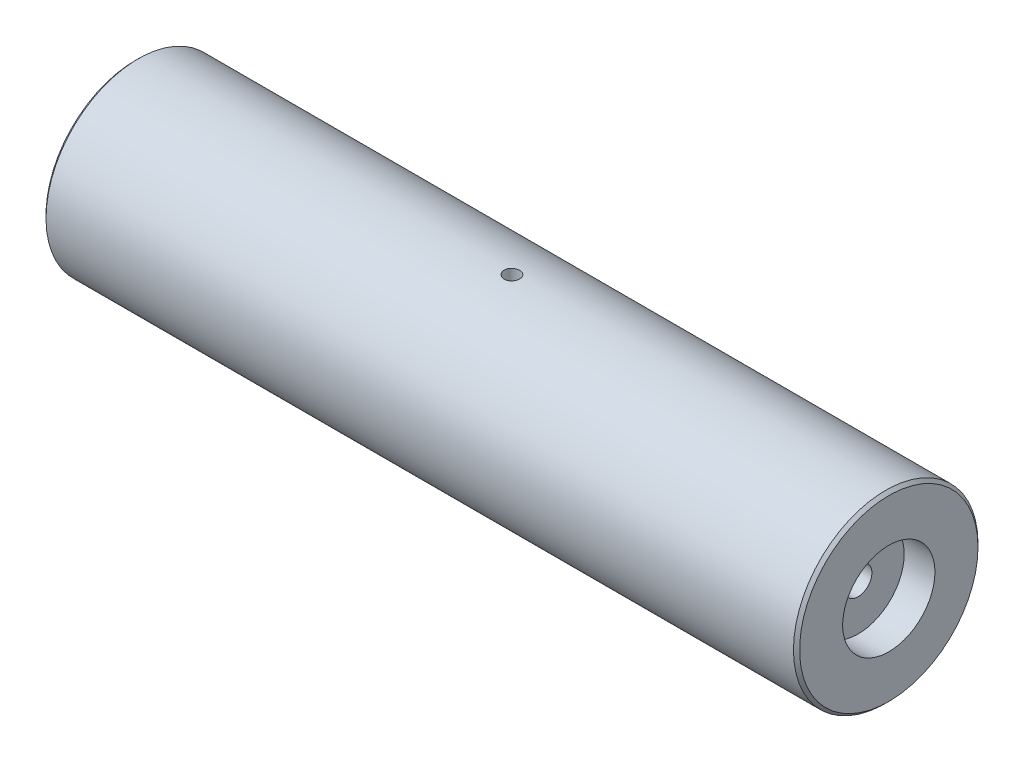
ISO-10303-21;
HEADER;
FILE_DESCRIPTION(('STEP AP214'),'2;1');
FILE_NAME('part.step','',(''),(''),'','','');
FILE_SCHEMA(('AUTOMOTIVE_DESIGN { 1 0 10303 214 1 1 1 1 }'));
ENDSEC;
DATA;
#1=APPLICATION_CONTEXT('core data for automotive mechanical design processes');
#2=APPLICATION_PROTOCOL_DEFINITION('international standard','automotive_design',2000,#1);
#3=PRODUCT_CONTEXT('',#1,'mechanical');
#4=PRODUCT('Part','Part','',(#3));
#5=PRODUCT_RELATED_PRODUCT_CATEGORY('part','',(#4));
#6=PRODUCT_DEFINITION_FORMATION('','',#4);
#7=PRODUCT_DEFINITION_CONTEXT('part definition',#1,'design');
#8=PRODUCT_DEFINITION('design','',#6,#7);
#9=PRODUCT_DEFINITION_SHAPE('','',#8);
#10=(LENGTH_UNIT() NAMED_UNIT(*) SI_UNIT(.MILLI.,.METRE.));
#11=(NAMED_UNIT(*) PLANE_ANGLE_UNIT() SI_UNIT($,.RADIAN.));
#12=(NAMED_UNIT(*) SI_UNIT($,.STERADIAN.) SOLID_ANGLE_UNIT());
#13=UNCERTAINTY_MEASURE_WITH_UNIT(LENGTH_MEASURE(1.E-05),#10,'distance_accuracy_value','');
#14=(GEOMETRIC_REPRESENTATION_CONTEXT(3) GLOBAL_UNCERTAINTY_ASSIGNED_CONTEXT((#13)) GLOBAL_UNIT_ASSIGNED_CONTEXT((#10,
#11,#12)) REPRESENTATION_CONTEXT('',''));
#15=CARTESIAN_POINT('',(0.,0.,0.));
#16=DIRECTION('',(0.,0.,1.));
#17=DIRECTION('',(1.,0.,0.));
#18=AXIS2_PLACEMENT_3D('',#15,#16,#17);
#19=CARTESIAN_POINT('',(245.,0.,0.));
#20=DIRECTION('',(-1.,0.,0.));
#21=DIRECTION('',(0.,0.,1.));
#22=AXIS2_PLACEMENT_3D('',#19,#20,#21);
#23=CYLINDRICAL_SURFACE('',#22,30.);
#24=CARTESIAN_POINT('',(122.5,29.8956518577535,2.49999999999999));
#25=CARTESIAN_POINT('',(122.359835728024,29.895653240209,2.49999387707594));
#26=CARTESIAN_POINT('',(122.219576034606,29.8966481995655,2.48817272989954));
#27=CARTESIAN_POINT('',(121.942937449141,29.9005204937316,2.44118994768571));
#28=CARTESIAN_POINT('',(121.806563137181,29.9033999613783,2.40600186590413));
#29=CARTESIAN_POINT('',(121.541742009687,29.9107128874002,2.31330996184381));
#30=CARTESIAN_POINT('',(121.413290747613,29.9151454646401,2.25581879093881));
#31=CARTESIAN_POINT('',(121.167892011975,29.9250640675404,2.12017517121363));
#32=CARTESIAN_POINT('',(121.050942086362,29.9305498679176,2.04202713953172));
#33=CARTESIAN_POINT('',(120.831534992333,29.9419726194871,1.86707134114508));
#34=CARTESIAN_POINT('',(120.729111420343,29.9479105692257,1.77022150350469));
#35=CARTESIAN_POINT('',(120.541953084405,29.9595594152693,1.56070030169023));
#36=CARTESIAN_POINT('',(120.457219093281,29.9652703016456,1.44802824663419));
#37=CARTESIAN_POINT('',(120.30773346336,29.9758310126879,1.20986061327197));
#38=CARTESIAN_POINT('',(120.243010892046,29.9806795804987,1.08434673031464));
#39=CARTESIAN_POINT('',(120.135571272204,29.9889585943072,0.824186001246907));
#40=CARTESIAN_POINT('',(120.092853838504,29.9923890651266,0.689539315040405));
#41=CARTESIAN_POINT('',(120.03073379036,29.9974383863167,0.41526948986953));
#42=CARTESIAN_POINT('',(120.011276822201,29.9990614594988,0.275658740580808));
#43=CARTESIAN_POINT('',(119.996061992039,30.0003274183556,-0.0048557047245437));
#44=CARTESIAN_POINT('',(120.000303689325,29.999970340854,-0.145759376648867));
#45=CARTESIAN_POINT('',(120.032321330448,29.9973197159698,-0.42449137879703));
#46=CARTESIAN_POINT('',(120.060038824511,29.9950309780632,-0.562326475181155));
#47=CARTESIAN_POINT('',(120.138130377405,29.9887799963655,-0.831381165100603));
#48=CARTESIAN_POINT('',(120.188504651806,29.9848177366516,-0.962600695678747));
#49=CARTESIAN_POINT('',(120.310544967796,29.9756571978073,-1.21488540159213));
#50=CARTESIAN_POINT('',(120.382237186497,29.9704574006341,-1.33593785664743));
#51=CARTESIAN_POINT('',(120.544859303947,29.9594061317313,-1.56431333969342));
#52=CARTESIAN_POINT('',(120.635789592914,29.9535546467843,-1.67163608912467));
#53=CARTESIAN_POINT('',(120.834636099888,29.9418366186817,-1.86984741195473));
#54=CARTESIAN_POINT('',(120.942603107047,29.9359700838166,-1.96068504166255));
#55=CARTESIAN_POINT('',(121.172281262791,29.9249010443095,-2.12295399730674));
#56=CARTESIAN_POINT('',(121.293992422705,29.9196985402148,-2.19438530724577));
#57=CARTESIAN_POINT('',(121.547739719429,29.9105456524246,-2.31581201148311));
#58=CARTESIAN_POINT('',(121.679777127367,29.9065954231836,-2.36580476183673));
#59=CARTESIAN_POINT('',(121.950411795127,29.9003973319995,-2.44289751757126));
#60=CARTESIAN_POINT('',(122.089008916974,29.898149434267,-2.46999800423699));
#61=CARTESIAN_POINT('',(122.368382966388,29.8956163224134,-2.50047245728153));
#62=CARTESIAN_POINT('',(122.509152093617,29.895325231706,-2.50391746529471));
#63=CARTESIAN_POINT('',(122.789265859124,29.8967231803454,-2.48716926261205));
#64=CARTESIAN_POINT('',(122.928610510676,29.898412201223,-2.46697627239704));
#65=CARTESIAN_POINT('',(123.201715889499,29.9035747036187,-2.40358450310619));
#66=CARTESIAN_POINT('',(123.335484364908,29.9070456133118,-2.36041887747361));
#67=CARTESIAN_POINT('',(123.593880205409,29.9153786744903,-2.25234085557459));
#68=CARTESIAN_POINT('',(123.718507423788,29.9202408482989,-2.18742811036766));
#69=CARTESIAN_POINT('',(123.955408130548,29.9308228365796,-2.03751871994737));
#70=CARTESIAN_POINT('',(124.067651570996,29.9365446608352,-1.95247473421259));
#71=CARTESIAN_POINT('',(124.276294852267,29.9481944443445,-1.76478532103877));
#72=CARTESIAN_POINT('',(124.372694420406,29.9541224071439,-1.66213959072317));
#73=CARTESIAN_POINT('',(124.547156014425,29.9655340277207,-1.44185343227936));
#74=CARTESIAN_POINT('',(124.625171882508,29.9710165449519,-1.32417638102458));
#75=CARTESIAN_POINT('',(124.760334783911,29.9809030967764,-1.07735048303601));
#76=CARTESIAN_POINT('',(124.817482025772,29.9853071421468,-0.948201750954445));
#77=CARTESIAN_POINT('',(124.90920620604,29.9925352804838,-0.682263946917598));
#78=CARTESIAN_POINT('',(124.943811687865,29.9953613708791,-0.545484776301518));
#79=CARTESIAN_POINT('',(124.989563314385,29.9991232832458,-0.268032947665749));
#80=CARTESIAN_POINT('',(125.000709903129,30.0000591409968,-0.127360363394573));
#81=CARTESIAN_POINT('',(124.999222150998,29.9999351968345,0.153430120989753));
#82=CARTESIAN_POINT('',(124.986659745404,29.9988814316171,0.293548410528463));
#83=CARTESIAN_POINT('',(124.938260613721,29.9949085848886,0.569677780153328));
#84=CARTESIAN_POINT('',(124.902423856021,29.9919895008438,0.705688854660693));
#85=CARTESIAN_POINT('',(124.808511574694,29.9846135425984,0.969747616121868));
#86=CARTESIAN_POINT('',(124.750437343293,29.9801567577553,1.09779576530064));
#87=CARTESIAN_POINT('',(124.613706886506,29.9702039990198,1.34233643224755));
#88=CARTESIAN_POINT('',(124.535050986602,29.9647080415613,1.45882913271513));
#89=CARTESIAN_POINT('',(124.359119962877,29.9532739625408,1.67732022356363));
#90=CARTESIAN_POINT('',(124.261791611634,29.9473346073371,1.77927568996152));
#91=CARTESIAN_POINT('',(124.051374578185,29.9356936245053,1.96544456639884));
#92=CARTESIAN_POINT('',(123.938282084793,29.9299920547994,2.04965367362056));
#93=CARTESIAN_POINT('',(123.699327498248,29.9194606102169,2.19805344744713));
#94=CARTESIAN_POINT('',(123.573441874997,29.9146323887052,2.26220630864615));
#95=CARTESIAN_POINT('',(123.312731408163,29.9064144901315,2.36838225233448));
#96=CARTESIAN_POINT('',(123.177917043957,29.9030231600575,2.41043077732366));
#97=CARTESIAN_POINT('',(122.951922789432,29.8989352047016,2.4604952450152));
#98=CARTESIAN_POINT('',(122.862196368054,29.8977096097263,2.47528983514608));
#99=CARTESIAN_POINT('',(122.681659992063,29.8960674893075,2.49504418376664));
#100=CARTESIAN_POINT('',(122.590850040363,29.8956509616896,2.50000396868537));
#101=CARTESIAN_POINT('',(122.5,29.8956518577535,2.49999999999999));
#102=B_SPLINE_CURVE_WITH_KNOTS('',3,(#24,#25,#26,#27,#28,#29,#30,#31,#32,#33,#34,#35,#36,#37,
#38,#39,#40,#41,#42,#43,#44,#45,#46,#47,#48,#49,#50,#51,#52,#53,#54,#55,#56,#57,#58,#59,#60,#61,
#62,#63,#64,#65,#66,#67,#68,#69,#70,#71,#72,#73,#74,#75,#76,#77,#78,#79,#80,#81,#82,#83,#84,#85,
#86,#87,#88,#89,#90,#91,#92,#93,#94,#95,#96,#97,#98,#99,#100,#101),.UNSPECIFIED.,.T.,.F.,(4,2,2,
2,2,2,2,2,2,2,2,2,2,2,2,2,2,2,2,2,2,2,2,2,2,2,2,2,2,2,2,2,2,2,2,2,2,2,4),(0.,0.420161105126472,
0.840798561792926,1.26119776094297,1.68150713708954,2.10277327972936,2.52405782280751,
2.94595145651179,3.36783770529442,3.78873617555054,4.20962681865259,4.62947260311705,
5.04932238229936,5.4696898550251,5.89006585515615,6.3117196005701,6.73337369356762,
7.15507977278696,7.57677698587603,7.9972072107476,8.41763351413365,8.83745470924513,
9.25728264086358,9.67810782107507,10.098940243232,10.5208182934245,10.9426921276865,
11.364030722025,11.7853613408798,12.2054156584348,12.6254705465199,13.0455010288207,
13.4655248690967,13.8867643080923,14.3081057644344,14.7302367134679,15.1518807121845,
15.4242165606899,15.6965516773468),.UNSPECIFIED.);
#103=CARTESIAN_POINT('',(122.5,29.8956518577535,2.49999999999999));
#104=VERTEX_POINT('',#103);
#105=EDGE_CURVE('E11',#104,#104,#102,.T.);
#106=ORIENTED_EDGE('',*,*,#105,.T.);
#107=EDGE_LOOP('',(#106));
#108=FACE_BOUND('',#107,.T.);
#109=CARTESIAN_POINT('',(1.,0.,0.));
#110=DIRECTION('',(1.,0.,0.));
#111=DIRECTION('',(0.,0.,-1.));
#112=AXIS2_PLACEMENT_3D('',#109,#110,#111);
#113=CIRCLE('',#112,30.);
#114=CARTESIAN_POINT('',(1.,0.,-30.));
#115=VERTEX_POINT('',#114);
#116=EDGE_CURVE('E79',#115,#115,#113,.T.);
#117=ORIENTED_EDGE('',*,*,#116,.T.);
#118=EDGE_LOOP('',(#117));
#119=FACE_BOUND('',#118,.T.);
#120=CARTESIAN_POINT('',(244.,0.,0.));
#121=DIRECTION('',(1.,0.,0.));
#122=DIRECTION('',(0.,0.,-1.));
#123=AXIS2_PLACEMENT_3D('',#120,#121,#122);
#124=CIRCLE('',#123,30.);
#125=CARTESIAN_POINT('',(244.,0.,-30.));
#126=VERTEX_POINT('',#125);
#127=EDGE_CURVE('E75',#126,#126,#124,.F.);
#128=ORIENTED_EDGE('',*,*,#127,.T.);
#129=EDGE_LOOP('',(#128));
#130=FACE_BOUND('',#129,.T.);
#131=ADVANCED_FACE('F38',(#108,#119,#130),#23,.T.);
#132=CARTESIAN_POINT('',(245.,0.,0.));
#133=DIRECTION('',(1.,0.,0.));
#134=DIRECTION('',(0.,0.,-1.));
#135=AXIS2_PLACEMENT_3D('',#132,#133,#134);
#136=PLANE('',#135);
#137=CARTESIAN_POINT('',(245.,0.,0.));
#138=DIRECTION('',(1.,0.,0.));
#139=DIRECTION('',(0.,0.,-1.));
#140=AXIS2_PLACEMENT_3D('',#137,#138,#139);
#141=CIRCLE('',#140,15.);
#142=CARTESIAN_POINT('',(245.,0.,-15.));
#143=VERTEX_POINT('',#142);
#144=EDGE_CURVE('E63',#143,#143,#141,.T.);
#145=ORIENTED_EDGE('',*,*,#144,.F.);
#146=EDGE_LOOP('',(#145));
#147=FACE_BOUND('',#146,.T.);
#148=CARTESIAN_POINT('',(245.,0.,0.));
#149=DIRECTION('',(1.,0.,0.));
#150=DIRECTION('',(0.,0.,-1.));
#151=AXIS2_PLACEMENT_3D('',#148,#149,#150);
#152=CIRCLE('',#151,29.);
#153=CARTESIAN_POINT('',(245.,0.,-29.));
#154=VERTEX_POINT('',#153);
#155=EDGE_CURVE('E50',#154,#154,#152,.T.);
#156=ORIENTED_EDGE('',*,*,#155,.T.);
#157=EDGE_LOOP('',(#156));
#158=FACE_BOUND('',#157,.T.);
#159=ADVANCED_FACE('F88',(#147,#158),#136,.T.);
#160=CARTESIAN_POINT('',(0.,0.,0.));
#161=DIRECTION('',(1.,0.,0.));
#162=DIRECTION('',(0.,0.,-1.));
#163=AXIS2_PLACEMENT_3D('',#160,#161,#162);
#164=PLANE('',#163);
#165=CARTESIAN_POINT('',(0.,0.,0.));
#166=DIRECTION('',(1.,0.,0.));
#167=DIRECTION('',(0.,0.,-1.));
#168=AXIS2_PLACEMENT_3D('',#165,#166,#167);
#169=CIRCLE('',#168,29.);
#170=CARTESIAN_POINT('',(0.,0.,-29.));
#171=VERTEX_POINT('',#170);
#172=EDGE_CURVE('E82',#171,#171,#169,.F.);
#173=ORIENTED_EDGE('',*,*,#172,.T.);
#174=EDGE_LOOP('',(#173));
#175=FACE_BOUND('',#174,.T.);
#176=ADVANCED_FACE('F101',(#175),#164,.F.);
#177=CARTESIAN_POINT('',(1.,0.,0.));
#178=DIRECTION('',(1.,0.,0.));
#179=DIRECTION('',(0.,0.,-1.));
#180=AXIS2_PLACEMENT_3D('',#177,#178,#179);
#181=CONICAL_SURFACE('',#180,30.,0.78539816339746);
#182=ORIENTED_EDGE('',*,*,#172,.F.);
#183=EDGE_LOOP('',(#182));
#184=FACE_BOUND('',#183,.T.);
#185=ORIENTED_EDGE('',*,*,#116,.F.);
#186=EDGE_LOOP('',(#185));
#187=FACE_BOUND('',#186,.T.);
#188=ADVANCED_FACE('F92',(#184,#187),#181,.T.);
#189=CARTESIAN_POINT('',(245.,0.,0.));
#190=DIRECTION('',(-1.,0.,0.));
#191=DIRECTION('',(0.,0.,1.));
#192=AXIS2_PLACEMENT_3D('',#189,#190,#191);
#193=CONICAL_SURFACE('',#192,29.,0.78539816339745);
#194=ORIENTED_EDGE('',*,*,#127,.F.);
#195=EDGE_LOOP('',(#194));
#196=FACE_BOUND('',#195,.T.);
#197=ORIENTED_EDGE('',*,*,#155,.F.);
#198=EDGE_LOOP('',(#197));
#199=FACE_BOUND('',#198,.T.);
#200=ADVANCED_FACE('F40',(#196,#199),#193,.T.);
#201=CARTESIAN_POINT('',(235.,0.,0.));
#202=DIRECTION('',(1.,0.,0.));
#203=DIRECTION('',(0.,0.,-1.));
#204=AXIS2_PLACEMENT_3D('',#201,#202,#203);
#205=CYLINDRICAL_SURFACE('',#204,15.);
#206=CARTESIAN_POINT('',(235.,0.,0.));
#207=DIRECTION('',(1.,0.,0.));
#208=DIRECTION('',(0.,0.,-1.));
#209=AXIS2_PLACEMENT_3D('',#206,#207,#208);
#210=CIRCLE('',#209,15.);
#211=CARTESIAN_POINT('',(235.,0.,-15.));
#212=VERTEX_POINT('',#211);
#213=EDGE_CURVE('E67',#212,#212,#210,.T.);
#214=ORIENTED_EDGE('',*,*,#213,.F.);
#215=EDGE_LOOP('',(#214));
#216=FACE_BOUND('',#215,.T.);
#217=ORIENTED_EDGE('',*,*,#144,.T.);
#218=EDGE_LOOP('',(#217));
#219=FACE_BOUND('',#218,.T.);
#220=ADVANCED_FACE('F91',(#216,#219),#205,.F.);
#221=CARTESIAN_POINT('',(235.,0.,0.));
#222=DIRECTION('',(1.,0.,0.));
#223=DIRECTION('',(0.,0.,-1.));
#224=AXIS2_PLACEMENT_3D('',#221,#222,#223);
#225=PLANE('',#224);
#226=CARTESIAN_POINT('',(235.,0.,0.));
#227=DIRECTION('',(1.,0.,0.));
#228=DIRECTION('',(0.,0.,-1.));
#229=AXIS2_PLACEMENT_3D('',#226,#227,#228);
#230=CIRCLE('',#229,4.5);
#231=CARTESIAN_POINT('',(235.,0.,-4.49999999999999));
#232=VERTEX_POINT('',#231);
#233=EDGE_CURVE('E133',#232,#232,#230,.T.);
#234=ORIENTED_EDGE('',*,*,#233,.F.);
#235=EDGE_LOOP('',(#234));
#236=FACE_BOUND('',#235,.T.);
#237=ORIENTED_EDGE('',*,*,#213,.T.);
#238=EDGE_LOOP('',(#237));
#239=FACE_BOUND('',#238,.T.);
#240=ADVANCED_FACE('F98',(#236,#239),#225,.T.);
#241=CARTESIAN_POINT('',(215.,0.,0.));
#242=DIRECTION('',(1.,0.,0.));
#243=DIRECTION('',(0.,0.,-1.));
#244=AXIS2_PLACEMENT_3D('',#241,#242,#243);
#245=CONICAL_SURFACE('',#244,4.5,1.02974425867665);
#246=CARTESIAN_POINT('',(215.,0.,0.));
#247=DIRECTION('',(1.,0.,0.));
#248=DIRECTION('',(0.,0.,-1.));
#249=AXIS2_PLACEMENT_3D('',#246,#247,#248);
#250=CIRCLE('',#249,4.5);
#251=CARTESIAN_POINT('',(215.,0.,-4.49999999999998));
#252=VERTEX_POINT('',#251);
#253=EDGE_CURVE('E70',#252,#252,#250,.T.);
#254=ORIENTED_EDGE('',*,*,#253,.T.);
#255=EDGE_LOOP('',(#254));
#256=FACE_BOUND('',#255,.T.);
#257=CARTESIAN_POINT('',(214.699569690486,0.,0.));
#258=DIRECTION('',(1.,0.,0.));
#259=DIRECTION('',(0.,0.,-1.));
#260=AXIS2_PLACEMENT_3D('',#257,#258,#259);
#261=CIRCLE('',#260,3.99999999999998);
#262=CARTESIAN_POINT('',(214.699569690486,0.,-3.99999999999997));
#263=VERTEX_POINT('',#262);
#264=EDGE_CURVE('E64',#263,#263,#261,.T.);
#265=ORIENTED_EDGE('',*,*,#264,.F.);
#266=EDGE_LOOP('',(#265));
#267=FACE_BOUND('',#266,.T.);
#268=ADVANCED_FACE('F118',(#256,#267),#245,.F.);
#269=CARTESIAN_POINT('',(235.,0.,0.));
#270=DIRECTION('',(1.,0.,0.));
#271=DIRECTION('',(0.,0.,-1.));
#272=AXIS2_PLACEMENT_3D('',#269,#270,#271);
#273=CYLINDRICAL_SURFACE('',#272,4.5);
#274=ORIENTED_EDGE('',*,*,#253,.F.);
#275=EDGE_LOOP('',(#274));
#276=FACE_BOUND('',#275,.T.);
#277=ORIENTED_EDGE('',*,*,#233,.T.);
#278=EDGE_LOOP('',(#277));
#279=FACE_BOUND('',#278,.T.);
#280=ADVANCED_FACE('F57',(#276,#279),#273,.F.);
#281=CARTESIAN_POINT('',(117.5,0.,0.));
#282=DIRECTION('',(1.,0.,0.));
#283=DIRECTION('',(0.,0.,-1.));
#284=AXIS2_PLACEMENT_3D('',#281,#282,#283);
#285=CONICAL_SURFACE('',#284,3.99999999999998,1.02974425867665);
#286=CARTESIAN_POINT('',(115.09655752389,0.,0.));
#287=VERTEX_POINT('',#286);
#288=VERTEX_LOOP('',#287);
#289=FACE_BOUND('',#288,.T.);
#290=CARTESIAN_POINT('',(117.5,0.,0.));
#291=DIRECTION('',(1.,0.,0.));
#292=DIRECTION('',(0.,0.,-1.));
#293=AXIS2_PLACEMENT_3D('',#290,#291,#292);
#294=CIRCLE('',#293,3.99999999999998);
#295=CARTESIAN_POINT('',(117.5,0.,-3.99999999999997));
#296=VERTEX_POINT('',#295);
#297=EDGE_CURVE('E61',#296,#296,#294,.T.);
#298=ORIENTED_EDGE('',*,*,#297,.T.);
#299=EDGE_LOOP('',(#298));
#300=FACE_BOUND('',#299,.T.);
#301=ADVANCED_FACE('F53',(#289,#300),#285,.F.);
#302=CARTESIAN_POINT('',(235.,0.,0.));
#303=DIRECTION('',(1.,0.,0.));
#304=DIRECTION('',(0.,0.,-1.));
#305=AXIS2_PLACEMENT_3D('',#302,#303,#304);
#306=CYLINDRICAL_SURFACE('',#305,3.99999999999998);
#307=CARTESIAN_POINT('',(122.5,3.12249899919919,2.49999999999999));
#308=CARTESIAN_POINT('',(122.562156751446,3.1224999155542,2.49999941097138));
#309=CARTESIAN_POINT('',(122.624325946671,3.12436490733916,2.49767581942172));
#310=CARTESIAN_POINT('',(122.748117179548,3.13172923119025,2.48843349840855));
#311=CARTESIAN_POINT('',(122.809738873257,3.13723070381364,2.48151206248432));
#312=CARTESIAN_POINT('',(122.993226047744,3.15888953558504,2.45397595058364));
#313=CARTESIAN_POINT('',(123.113548331189,3.18020036271142,2.42658990946458));
#314=CARTESIAN_POINT('',(123.345598197878,3.23299770760367,2.35576217141197));
#315=CARTESIAN_POINT('',(123.457390415055,3.26439575383208,2.31245961359201));
#316=CARTESIAN_POINT('',(123.672008525334,3.33366000884439,2.21143916430898));
#317=CARTESIAN_POINT('',(123.774834173753,3.37152639405533,2.15372087963017));
#318=CARTESIAN_POINT('',(123.983733981304,3.45559225121875,2.01647682425577));
#319=CARTESIAN_POINT('',(124.088393325005,3.50222814511577,1.93506425666948));
#320=CARTESIAN_POINT('',(124.283761551624,3.59505503533367,1.75662526657431));
#321=CARTESIAN_POINT('',(124.374458279954,3.64124561158437,1.65958538899781));
#322=CARTESIAN_POINT('',(124.550220298173,3.73459524771313,1.43833990582853));
#323=CARTESIAN_POINT('',(124.63328618445,3.78119887781503,1.31226934259651));
#324=CARTESIAN_POINT('',(124.740545154736,3.84307251838773,1.11163395543429));
#325=CARTESIAN_POINT('',(124.773415138333,3.8623628309205,1.04281240974104));
#326=CARTESIAN_POINT('',(124.832954685363,3.89770436975434,0.901758767615555));
#327=CARTESIAN_POINT('',(124.859628531038,3.91375783207116,0.829529068393804));
#328=CARTESIAN_POINT('',(124.903983815256,3.94066759113821,0.689700297916583));
#329=CARTESIAN_POINT('',(124.922301976518,3.95188535984464,0.622371981278594));
#330=CARTESIAN_POINT('',(124.953302286313,3.9709624190916,0.485997575898812));
#331=CARTESIAN_POINT('',(124.965987689216,3.97882364879719,0.416952503441687));
#332=CARTESIAN_POINT('',(124.985513797635,3.99095470334735,0.277765449857178));
#333=CARTESIAN_POINT('',(124.992358116513,3.99522674847832,0.207624174243909));
#334=CARTESIAN_POINT('',(125.000099213389,4.00006125072436,0.0669114466599402));
#335=CARTESIAN_POINT('',(125.000996675963,4.00062413482247,-0.00365995486027806));
#336=CARTESIAN_POINT('',(124.995274626453,3.99704479619501,-0.196045081555535));
#337=CARTESIAN_POINT('',(124.982693496921,3.98917040897434,-0.31768184548853));
#338=CARTESIAN_POINT('',(124.940269782034,3.96290903275929,-0.556636494620247));
#339=CARTESIAN_POINT('',(124.910425892026,3.94452124920476,-0.673954052677418));
#340=CARTESIAN_POINT('',(124.834791440717,3.89876170711607,-0.901771991763859));
#341=CARTESIAN_POINT('',(124.788960080429,3.87136697381045,-1.01225407159606));
#342=CARTESIAN_POINT('',(124.683062761016,3.80971291751352,-1.22404012071222));
#343=CARTESIAN_POINT('',(124.622993558936,3.77545203089316,-1.32534199174244));
#344=CARTESIAN_POINT('',(124.481943583076,3.69786441247165,-1.52942649744658));
#345=CARTESIAN_POINT('',(124.39929072331,3.65394006381519,-1.63082454612906));
#346=CARTESIAN_POINT('',(124.219735262793,3.56390927740505,-1.81919733573062));
#347=CARTESIAN_POINT('',(124.122811953616,3.51779973570407,-1.90615071842623));
#348=CARTESIAN_POINT('',(123.902588746827,3.42142883464464,-2.07470887167908));
#349=CARTESIAN_POINT('',(123.777497236642,3.37141162686595,-2.15413229677842));
#350=CARTESIAN_POINT('',(123.512707762699,3.28028278192381,-2.29052307550562));
#351=CARTESIAN_POINT('',(123.373037312547,3.23915480386929,-2.34753179448502));
#352=CARTESIAN_POINT('',(123.120461193894,3.18183753131761,-2.4243713352793));
#353=CARTESIAN_POINT('',(123.010178074787,3.16193408602511,-2.45003683445403));
#354=CARTESIAN_POINT('',(122.78576962244,3.13358277759545,-2.4862033707309));
#355=CARTESIAN_POINT('',(122.671649757343,3.12511926504437,-2.4967251252081));
#356=CARTESIAN_POINT('',(122.442542639498,3.12092267030675,-2.50197072095179));
#357=CARTESIAN_POINT('',(122.327553999522,3.12521876170183,-2.49665835896694));
#358=CARTESIAN_POINT('',(122.100438835682,3.14592085836186,-2.47051466367813));
#359=CARTESIAN_POINT('',(121.988314761629,3.16233689222904,-2.44967047849125));
#360=CARTESIAN_POINT('',(121.771563240574,3.20460120797141,-2.39409874195037));
#361=CARTESIAN_POINT('',(121.666842684106,3.23028954367815,-2.35960571424757));
#362=CARTESIAN_POINT('',(121.464425300106,3.28831148388747,-2.27804893702242));
#363=CARTESIAN_POINT('',(121.366730981122,3.32064744602079,-2.23098072583746));
#364=CARTESIAN_POINT('',(121.161388058337,3.39574401285201,-2.11530798730693));
#365=CARTESIAN_POINT('',(121.055385472698,3.43931724293013,-2.04430931160543));
#366=CARTESIAN_POINT('',(120.855629339346,3.52787943213336,-1.88737868921489));
#367=CARTESIAN_POINT('',(120.761888678758,3.57286982004465,-1.80143124902619));
#368=CARTESIAN_POINT('',(120.574035929359,3.66766209459503,-1.6007693249212));
#369=CARTESIAN_POINT('',(120.482272601515,3.71707933883199,-1.48365201617176));
#370=CARTESIAN_POINT('',(120.31985298528,3.80768973398604,-1.23256787407809));
#371=CARTESIAN_POINT('',(120.249186804873,3.84888673619007,-1.09860897940974));
#372=CARTESIAN_POINT('',(120.163418932025,3.89988966499774,-0.891930804655081));
#373=CARTESIAN_POINT('',(120.138702556049,3.91477055097243,-0.824318196039419));
#374=CARTESIAN_POINT('',(120.095061723268,3.94124643918617,-0.686640792876424));
#375=CARTESIAN_POINT('',(120.076133913849,3.95284334314803,-0.616577444051139));
#376=CARTESIAN_POINT('',(120.044394169861,3.97238512039948,-0.47463923146427));
#377=CARTESIAN_POINT('',(120.031576900484,3.98033317908834,-0.402766005755514));
#378=CARTESIAN_POINT('',(120.012260827707,3.99234168343341,-0.257881807142468));
#379=CARTESIAN_POINT('',(120.005760979069,3.99640277220022,-0.184871024482542));
#380=CARTESIAN_POINT('',(119.996928484493,4.00191521492704,0.0131102774248851));
#381=CARTESIAN_POINT('',(120.000734207091,3.99952706123945,0.138539079205442));
#382=CARTESIAN_POINT('',(120.026917589546,3.98321975018361,0.386583137102124));
#383=CARTESIAN_POINT('',(120.049294406679,3.96930111604855,0.509198520626822));
#384=CARTESIAN_POINT('',(120.110322415546,3.93192083384284,0.744080605483839));
#385=CARTESIAN_POINT('',(120.148382073565,3.90880701054802,0.856558752631798));
#386=CARTESIAN_POINT('',(120.239119462443,3.85489971248842,1.07343034721916));
#387=CARTESIAN_POINT('',(120.291799659567,3.82410494215307,1.17782242685801));
#388=CARTESIAN_POINT('',(120.41632127872,3.75350673935647,1.38731297754796));
#389=CARTESIAN_POINT('',(120.489583990757,3.71310001864656,1.49136012183778));
#390=CARTESIAN_POINT('',(120.650153232514,3.62867283985205,1.68643334934801));
#391=CARTESIAN_POINT('',(120.737475608834,3.58464833191203,1.77744451843679));
#392=CARTESIAN_POINT('',(120.938232515062,3.49000828219718,1.95744716561587));
#393=CARTESIAN_POINT('',(121.053616612571,3.43935738427104,2.04425661250061));
#394=CARTESIAN_POINT('',(121.29928940976,3.34349647457111,2.19754648509902));
#395=CARTESIAN_POINT('',(121.429569811153,3.2982834620419,2.26403815415026));
#396=CARTESIAN_POINT('',(121.672805300785,3.2285953978009,2.36198229412839));
#397=CARTESIAN_POINT('',(121.783270572154,3.20174639338769,2.39792458576828));
#398=CARTESIAN_POINT('',(122.009939343002,3.15878358104509,2.45425618419744));
#399=CARTESIAN_POINT('',(122.1261234198,3.14263581150428,2.47469472410166));
#400=CARTESIAN_POINT('',(122.286059994646,3.12952857640606,2.49119847139521));
#401=CARTESIAN_POINT('',(122.328725525709,3.12689994306769,2.49449433837958));
#402=CARTESIAN_POINT('',(122.414258698952,3.12338461939861,2.49889558125806));
#403=CARTESIAN_POINT('',(122.457126389243,3.12249836712871,2.50000040629186));
#404=CARTESIAN_POINT('',(122.5,3.12249899919919,2.49999999999999));
#405=B_SPLINE_CURVE_WITH_KNOTS('',3,(#307,#308,#309,#310,#311,#312,#313,#314,#315,#316,#317,
#318,#319,#320,#321,#322,#323,#324,#325,#326,#327,#328,#329,#330,#331,#332,#333,#334,#335,#336,
#337,#338,#339,#340,#341,#342,#343,#344,#345,#346,#347,#348,#349,#350,#351,#352,#353,#354,#355,
#356,#357,#358,#359,#360,#361,#362,#363,#364,#365,#366,#367,#368,#369,#370,#371,#372,#373,#374,
#375,#376,#377,#378,#379,#380,#381,#382,#383,#384,#385,#386,#387,#388,#389,#390,#391,#392,#393,
#394,#395,#396,#397,#398,#399,#400,#401,#402,#403,#404),.UNSPECIFIED.,.T.,.F.,(4,2,2,2,2,2,2,2,
2,2,2,2,2,2,2,2,2,2,2,2,2,2,2,2,2,2,2,2,2,2,2,2,2,2,2,2,2,2,2,2,2,2,2,2,2,2,2,2,4),(0.,
0.186415315858463,0.372940459994502,0.746478880764682,1.11682668423132,1.48718459072604,
1.9072279868507,2.32763499192877,2.79876029265969,3.03445880867312,3.26999394209507,
3.48170145743203,3.69328649746501,3.90474055342593,4.11617026725865,4.48184709708111,
4.84755156693917,5.21419620193001,5.58092442797432,5.99329080205305,6.40626158573462,
6.87316206383501,7.33919680735482,7.68265621505464,8.02564530559505,8.36941921026402,
8.71347788865086,9.0518649523212,9.39037223519195,9.79332737765183,10.1967026751543,
10.6647326786671,11.1325428866818,11.3527929661038,11.5729152387446,11.7928449800803,
12.0127383271001,12.3871595324233,12.7615637480925,13.1229788842093,13.4844550226785,
13.8834503840958,14.2828986410982,14.7399238503458,15.1966956936286,15.5530255473291,
15.9082190611886,16.0367696833384,16.1653526209167),.UNSPECIFIED.);
#406=CARTESIAN_POINT('',(122.5,3.12249899919919,2.49999999999999));
#407=VERTEX_POINT('',#406);
#408=EDGE_CURVE('E128',#407,#407,#405,.T.);
#409=ORIENTED_EDGE('',*,*,#408,.T.);
#410=EDGE_LOOP('',(#409));
#411=FACE_BOUND('',#410,.T.);
#412=ORIENTED_EDGE('',*,*,#264,.T.);
#413=EDGE_LOOP('',(#412));
#414=FACE_BOUND('',#413,.T.);
#415=ORIENTED_EDGE('',*,*,#297,.F.);
#416=EDGE_LOOP('',(#415));
#417=FACE_BOUND('',#416,.T.);
#418=ADVANCED_FACE('F56',(#411,#414,#417),#306,.F.);
#419=CARTESIAN_POINT('',(122.5,30.,0.));
#420=DIRECTION('',(0.,1.,0.));
#421=DIRECTION('',(0.,0.,1.));
#422=AXIS2_PLACEMENT_3D('',#419,#420,#421);
#423=CYLINDRICAL_SURFACE('',#422,2.49999999999999);
#424=ORIENTED_EDGE('',*,*,#105,.F.);
#425=EDGE_LOOP('',(#424));
#426=FACE_BOUND('',#425,.T.);
#427=ORIENTED_EDGE('',*,*,#408,.F.);
#428=EDGE_LOOP('',(#427));
#429=FACE_BOUND('',#428,.T.);
#430=ADVANCED_FACE('F124',(#426,#429),#423,.F.);
#431=CLOSED_SHELL('',(#131,#159,#176,#188,#200,#220,#240,#268,#280,#301,#418,#430));
#432=MANIFOLD_SOLID_BREP('B2',#431);
#433=ADVANCED_BREP_SHAPE_REPRESENTATION('',(#18,#432),#14);
#434=SHAPE_DEFINITION_REPRESENTATION(#9,#433);
ENDSEC;
END-ISO-10303-21;
